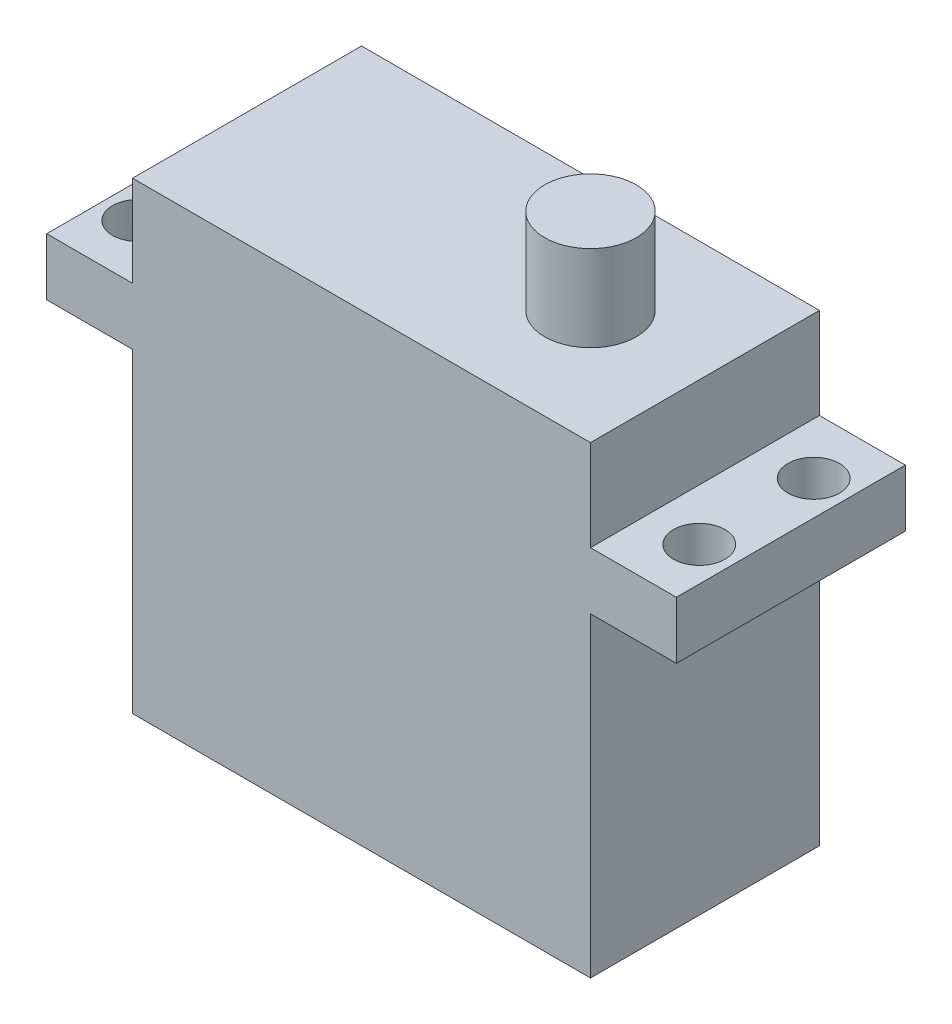
ISO-10303-21;
HEADER;
FILE_DESCRIPTION(('STEP AP214'),'2;1');
FILE_NAME('part.step','',(''),(''),'','','');
FILE_SCHEMA(('AUTOMOTIVE_DESIGN { 1 0 10303 214 1 1 1 1 }'));
ENDSEC;
DATA;
#1=APPLICATION_CONTEXT('core data for automotive mechanical design processes');
#2=APPLICATION_PROTOCOL_DEFINITION('international standard','automotive_design',2000,#1);
#3=PRODUCT_CONTEXT('',#1,'mechanical');
#4=PRODUCT('Part','Part','',(#3));
#5=PRODUCT_RELATED_PRODUCT_CATEGORY('part','',(#4));
#6=PRODUCT_DEFINITION_FORMATION('','',#4);
#7=PRODUCT_DEFINITION_CONTEXT('part definition',#1,'design');
#8=PRODUCT_DEFINITION('design','',#6,#7);
#9=PRODUCT_DEFINITION_SHAPE('','',#8);
#10=(LENGTH_UNIT() NAMED_UNIT(*) SI_UNIT(.MILLI.,.METRE.));
#11=(NAMED_UNIT(*) PLANE_ANGLE_UNIT() SI_UNIT($,.RADIAN.));
#12=(NAMED_UNIT(*) SI_UNIT($,.STERADIAN.) SOLID_ANGLE_UNIT());
#13=UNCERTAINTY_MEASURE_WITH_UNIT(LENGTH_MEASURE(1.E-05),#10,'distance_accuracy_value','');
#14=(GEOMETRIC_REPRESENTATION_CONTEXT(3) GLOBAL_UNCERTAINTY_ASSIGNED_CONTEXT((#13)) GLOBAL_UNIT_ASSIGNED_CONTEXT((#10,
#11,#12)) REPRESENTATION_CONTEXT('',''));
#15=CARTESIAN_POINT('',(0.,0.,0.));
#16=DIRECTION('',(0.,0.,1.));
#17=DIRECTION('',(1.,0.,0.));
#18=AXIS2_PLACEMENT_3D('',#15,#16,#17);
#19=CARTESIAN_POINT('',(-20.,40.5,-10.));
#20=DIRECTION('',(1.,0.,0.));
#21=DIRECTION('',(0.,0.,-1.));
#22=AXIS2_PLACEMENT_3D('',#19,#20,#21);
#23=PLANE('',#22);
#24=DIRECTION('',(0.,-1.,0.));
#25=VECTOR('',#24,1.);
#26=CARTESIAN_POINT('',(-20.,40.5,10.));
#27=LINE('',#26,#25);
#28=CARTESIAN_POINT('',(-20.,27.55,10.));
#29=VERTEX_POINT('',#28);
#30=CARTESIAN_POINT('',(-20.,0.,10.));
#31=VERTEX_POINT('',#30);
#32=EDGE_CURVE('E252',#29,#31,#27,.T.);
#33=ORIENTED_EDGE('',*,*,#32,.F.);
#34=DIRECTION('',(0.,0.,-1.));
#35=VECTOR('',#34,1.);
#36=CARTESIAN_POINT('',(-20.,27.55,10.));
#37=LINE('',#36,#35);
#38=CARTESIAN_POINT('',(-20.,27.55,-10.));
#39=VERTEX_POINT('',#38);
#40=EDGE_CURVE('E158',#29,#39,#37,.T.);
#41=ORIENTED_EDGE('',*,*,#40,.T.);
#42=DIRECTION('',(0.,-1.,0.));
#43=VECTOR('',#42,1.);
#44=CARTESIAN_POINT('',(-20.,40.5,-10.));
#45=LINE('',#44,#43);
#46=CARTESIAN_POINT('',(-20.,0.,-10.));
#47=VERTEX_POINT('',#46);
#48=EDGE_CURVE('E255',#39,#47,#45,.T.);
#49=ORIENTED_EDGE('',*,*,#48,.T.);
#50=DIRECTION('',(0.,0.,1.));
#51=VECTOR('',#50,1.);
#52=CARTESIAN_POINT('',(-20.,0.,-10.));
#53=LINE('',#52,#51);
#54=EDGE_CURVE('E243',#47,#31,#53,.T.);
#55=ORIENTED_EDGE('',*,*,#54,.T.);
#56=EDGE_LOOP('',(#33,#41,#49,#55));
#57=FACE_BOUND('',#56,.T.);
#58=ADVANCED_FACE('F45',(#57),#23,.F.);
#59=CARTESIAN_POINT('',(20.,40.5,-10.));
#60=DIRECTION('',(-1.,0.,0.));
#61=DIRECTION('',(0.,0.,1.));
#62=AXIS2_PLACEMENT_3D('',#59,#60,#61);
#63=PLANE('',#62);
#64=DIRECTION('',(0.,0.,1.));
#65=VECTOR('',#64,1.);
#66=CARTESIAN_POINT('',(20.,32.55,10.));
#67=LINE('',#66,#65);
#68=CARTESIAN_POINT('',(20.,32.55,-10.));
#69=VERTEX_POINT('',#68);
#70=CARTESIAN_POINT('',(20.,32.55,10.));
#71=VERTEX_POINT('',#70);
#72=EDGE_CURVE('E190',#69,#71,#67,.T.);
#73=ORIENTED_EDGE('',*,*,#72,.F.);
#74=DIRECTION('',(0.,-1.,0.));
#75=VECTOR('',#74,1.);
#76=CARTESIAN_POINT('',(20.,40.5,-10.));
#77=LINE('',#76,#75);
#78=CARTESIAN_POINT('',(20.,40.5,-10.));
#79=VERTEX_POINT('',#78);
#80=EDGE_CURVE('E11',#79,#69,#77,.T.);
#81=ORIENTED_EDGE('',*,*,#80,.F.);
#82=DIRECTION('',(0.,0.,-1.));
#83=VECTOR('',#82,1.);
#84=CARTESIAN_POINT('',(20.,40.5,-10.));
#85=LINE('',#84,#83);
#86=CARTESIAN_POINT('',(20.,40.5,10.));
#87=VERTEX_POINT('',#86);
#88=EDGE_CURVE('E221',#87,#79,#85,.T.);
#89=ORIENTED_EDGE('',*,*,#88,.F.);
#90=DIRECTION('',(0.,-1.,0.));
#91=VECTOR('',#90,1.);
#92=CARTESIAN_POINT('',(20.,40.5,10.));
#93=LINE('',#92,#91);
#94=EDGE_CURVE('E249',#87,#71,#93,.T.);
#95=ORIENTED_EDGE('',*,*,#94,.T.);
#96=EDGE_LOOP('',(#73,#81,#89,#95));
#97=FACE_BOUND('',#96,.T.);
#98=ADVANCED_FACE('F47',(#97),#63,.F.);
#99=DIRECTION('',(0.,0.,-1.));
#100=VECTOR('',#99,1.);
#101=CARTESIAN_POINT('',(20.,27.55,10.));
#102=LINE('',#101,#100);
#103=CARTESIAN_POINT('',(20.,27.55,10.));
#104=VERTEX_POINT('',#103);
#105=CARTESIAN_POINT('',(20.,27.55,-10.));
#106=VERTEX_POINT('',#105);
#107=EDGE_CURVE('E71',#104,#106,#102,.T.);
#108=ORIENTED_EDGE('',*,*,#107,.F.);
#109=CARTESIAN_POINT('',(20.,0.,10.));
#110=VERTEX_POINT('',#109);
#111=EDGE_CURVE('E235',#104,#110,#93,.T.);
#112=ORIENTED_EDGE('',*,*,#111,.T.);
#113=DIRECTION('',(0.,0.,-1.));
#114=VECTOR('',#113,1.);
#115=CARTESIAN_POINT('',(20.,0.,-10.));
#116=LINE('',#115,#114);
#117=CARTESIAN_POINT('',(20.,0.,-10.));
#118=VERTEX_POINT('',#117);
#119=EDGE_CURVE('E220',#110,#118,#116,.T.);
#120=ORIENTED_EDGE('',*,*,#119,.T.);
#121=EDGE_CURVE('E55',#106,#118,#77,.T.);
#122=ORIENTED_EDGE('',*,*,#121,.F.);
#123=EDGE_LOOP('',(#108,#112,#120,#122));
#124=FACE_BOUND('',#123,.T.);
#125=ADVANCED_FACE('F336',(#124),#63,.F.);
#126=CARTESIAN_POINT('',(-20.,40.5,-10.));
#127=DIRECTION('',(0.,0.,1.));
#128=DIRECTION('',(1.,0.,0.));
#129=AXIS2_PLACEMENT_3D('',#126,#127,#128);
#130=PLANE('',#129);
#131=DIRECTION('',(-1.,0.,0.));
#132=VECTOR('',#131,1.);
#133=CARTESIAN_POINT('',(-20.,0.,-10.));
#134=LINE('',#133,#132);
#135=EDGE_CURVE('E239',#118,#47,#134,.T.);
#136=ORIENTED_EDGE('',*,*,#135,.T.);
#137=ORIENTED_EDGE('',*,*,#48,.F.);
#138=DIRECTION('',(1.,0.,0.));
#139=VECTOR('',#138,1.);
#140=CARTESIAN_POINT('',(-27.5,27.55,-10.));
#141=LINE('',#140,#139);
#142=CARTESIAN_POINT('',(-27.5,27.55,-10.));
#143=VERTEX_POINT('',#142);
#144=EDGE_CURVE('E180',#143,#39,#141,.T.);
#145=ORIENTED_EDGE('',*,*,#144,.F.);
#146=DIRECTION('',(0.,1.,0.));
#147=VECTOR('',#146,1.);
#148=CARTESIAN_POINT('',(-27.5,32.55,-10.));
#149=LINE('',#148,#147);
#150=CARTESIAN_POINT('',(-27.5,32.55,-10.));
#151=VERTEX_POINT('',#150);
#152=EDGE_CURVE('E162',#143,#151,#149,.T.);
#153=ORIENTED_EDGE('',*,*,#152,.T.);
#154=DIRECTION('',(1.,0.,0.));
#155=VECTOR('',#154,1.);
#156=CARTESIAN_POINT('',(-27.5,32.55,-10.));
#157=LINE('',#156,#155);
#158=CARTESIAN_POINT('',(-20.,32.55,-10.));
#159=VERTEX_POINT('',#158);
#160=EDGE_CURVE('E147',#151,#159,#157,.T.);
#161=ORIENTED_EDGE('',*,*,#160,.T.);
#162=CARTESIAN_POINT('',(-20.,40.5,-10.));
#163=VERTEX_POINT('',#162);
#164=EDGE_CURVE('E256',#163,#159,#45,.T.);
#165=ORIENTED_EDGE('',*,*,#164,.F.);
#166=DIRECTION('',(-1.,0.,0.));
#167=VECTOR('',#166,1.);
#168=CARTESIAN_POINT('',(-20.,40.5,-10.));
#169=LINE('',#168,#167);
#170=EDGE_CURVE('E225',#79,#163,#169,.T.);
#171=ORIENTED_EDGE('',*,*,#170,.F.);
#172=ORIENTED_EDGE('',*,*,#80,.T.);
#173=DIRECTION('',(-1.,0.,0.));
#174=VECTOR('',#173,1.);
#175=CARTESIAN_POINT('',(27.5,32.55,-10.));
#176=LINE('',#175,#174);
#177=CARTESIAN_POINT('',(27.5,32.55,-10.));
#178=VERTEX_POINT('',#177);
#179=EDGE_CURVE('E208',#178,#69,#176,.T.);
#180=ORIENTED_EDGE('',*,*,#179,.F.);
#181=DIRECTION('',(0.,1.,0.));
#182=VECTOR('',#181,1.);
#183=CARTESIAN_POINT('',(27.5,32.55,-10.));
#184=LINE('',#183,#182);
#185=CARTESIAN_POINT('',(27.5,27.55,-10.));
#186=VERTEX_POINT('',#185);
#187=EDGE_CURVE('E193',#186,#178,#184,.T.);
#188=ORIENTED_EDGE('',*,*,#187,.F.);
#189=DIRECTION('',(-1.,0.,0.));
#190=VECTOR('',#189,1.);
#191=CARTESIAN_POINT('',(27.5,27.55,-10.));
#192=LINE('',#191,#190);
#193=EDGE_CURVE('E212',#186,#106,#192,.T.);
#194=ORIENTED_EDGE('',*,*,#193,.T.);
#195=ORIENTED_EDGE('',*,*,#121,.T.);
#196=EDGE_LOOP('',(#136,#137,#145,#153,#161,#165,#171,#172,#180,#188,#194,#195));
#197=FACE_BOUND('',#196,.T.);
#198=ADVANCED_FACE('F316',(#197),#130,.F.);
#199=ORIENTED_EDGE('',*,*,#164,.T.);
#200=DIRECTION('',(0.,0.,1.));
#201=VECTOR('',#200,1.);
#202=CARTESIAN_POINT('',(-20.,32.55,10.));
#203=LINE('',#202,#201);
#204=CARTESIAN_POINT('',(-20.,32.55,10.));
#205=VERTEX_POINT('',#204);
#206=EDGE_CURVE('E171',#159,#205,#203,.T.);
#207=ORIENTED_EDGE('',*,*,#206,.T.);
#208=CARTESIAN_POINT('',(-20.,40.5,10.));
#209=VERTEX_POINT('',#208);
#210=EDGE_CURVE('E145',#209,#205,#27,.T.);
#211=ORIENTED_EDGE('',*,*,#210,.F.);
#212=DIRECTION('',(0.,0.,1.));
#213=VECTOR('',#212,1.);
#214=CARTESIAN_POINT('',(-20.,40.5,-10.));
#215=LINE('',#214,#213);
#216=EDGE_CURVE('E229',#163,#209,#215,.T.);
#217=ORIENTED_EDGE('',*,*,#216,.F.);
#218=EDGE_LOOP('',(#199,#207,#211,#217));
#219=FACE_BOUND('',#218,.T.);
#220=ADVANCED_FACE('F322',(#219),#23,.F.);
#221=CARTESIAN_POINT('',(-20.,40.5,10.));
#222=DIRECTION('',(0.,0.,-1.));
#223=DIRECTION('',(-1.,0.,0.));
#224=AXIS2_PLACEMENT_3D('',#221,#222,#223);
#225=PLANE('',#224);
#226=DIRECTION('',(1.,0.,0.));
#227=VECTOR('',#226,1.);
#228=CARTESIAN_POINT('',(-20.,0.,10.));
#229=LINE('',#228,#227);
#230=EDGE_CURVE('E226',#31,#110,#229,.T.);
#231=ORIENTED_EDGE('',*,*,#230,.T.);
#232=ORIENTED_EDGE('',*,*,#111,.F.);
#233=DIRECTION('',(-1.,0.,0.));
#234=VECTOR('',#233,1.);
#235=CARTESIAN_POINT('',(27.5,27.55,10.));
#236=LINE('',#235,#234);
#237=CARTESIAN_POINT('',(27.5,27.55,10.));
#238=VERTEX_POINT('',#237);
#239=EDGE_CURVE('E216',#238,#104,#236,.T.);
#240=ORIENTED_EDGE('',*,*,#239,.F.);
#241=DIRECTION('',(0.,-1.,0.));
#242=VECTOR('',#241,1.);
#243=CARTESIAN_POINT('',(27.5,32.55,10.));
#244=LINE('',#243,#242);
#245=CARTESIAN_POINT('',(27.5,32.55,10.));
#246=VERTEX_POINT('',#245);
#247=EDGE_CURVE('E185',#246,#238,#244,.T.);
#248=ORIENTED_EDGE('',*,*,#247,.F.);
#249=DIRECTION('',(-1.,0.,0.));
#250=VECTOR('',#249,1.);
#251=CARTESIAN_POINT('',(27.5,32.55,10.));
#252=LINE('',#251,#250);
#253=EDGE_CURVE('E199',#246,#71,#252,.T.);
#254=ORIENTED_EDGE('',*,*,#253,.T.);
#255=ORIENTED_EDGE('',*,*,#94,.F.);
#256=DIRECTION('',(1.,0.,0.));
#257=VECTOR('',#256,1.);
#258=CARTESIAN_POINT('',(-20.,40.5,10.));
#259=LINE('',#258,#257);
#260=EDGE_CURVE('E232',#209,#87,#259,.T.);
#261=ORIENTED_EDGE('',*,*,#260,.F.);
#262=ORIENTED_EDGE('',*,*,#210,.T.);
#263=DIRECTION('',(1.,0.,0.));
#264=VECTOR('',#263,1.);
#265=CARTESIAN_POINT('',(-27.5,32.55,10.));
#266=LINE('',#265,#264);
#267=CARTESIAN_POINT('',(-27.5,32.55,10.));
#268=VERTEX_POINT('',#267);
#269=EDGE_CURVE('E63',#268,#205,#266,.T.);
#270=ORIENTED_EDGE('',*,*,#269,.F.);
#271=DIRECTION('',(0.,-1.,0.));
#272=VECTOR('',#271,1.);
#273=CARTESIAN_POINT('',(-27.5,32.55,10.));
#274=LINE('',#273,#272);
#275=CARTESIAN_POINT('',(-27.5,27.55,10.));
#276=VERTEX_POINT('',#275);
#277=EDGE_CURVE('E141',#268,#276,#274,.T.);
#278=ORIENTED_EDGE('',*,*,#277,.T.);
#279=DIRECTION('',(1.,0.,0.));
#280=VECTOR('',#279,1.);
#281=CARTESIAN_POINT('',(-27.5,27.55,10.));
#282=LINE('',#281,#280);
#283=EDGE_CURVE('E170',#276,#29,#282,.T.);
#284=ORIENTED_EDGE('',*,*,#283,.T.);
#285=ORIENTED_EDGE('',*,*,#32,.T.);
#286=EDGE_LOOP('',(#231,#232,#240,#248,#254,#255,#261,#262,#270,#278,#284,#285));
#287=FACE_BOUND('',#286,.T.);
#288=ADVANCED_FACE('F140',(#287),#225,.F.);
#289=CARTESIAN_POINT('',(0.,40.5,0.));
#290=DIRECTION('',(0.,1.,0.));
#291=DIRECTION('',(0.,0.,1.));
#292=AXIS2_PLACEMENT_3D('',#289,#290,#291);
#293=PLANE('',#292);
#294=CARTESIAN_POINT('',(10.,40.5,0.));
#295=DIRECTION('',(0.,1.,0.));
#296=DIRECTION('',(0.,0.,1.));
#297=AXIS2_PLACEMENT_3D('',#294,#295,#296);
#298=CIRCLE('',#297,4.);
#299=CARTESIAN_POINT('',(10.,40.5,4.));
#300=VERTEX_POINT('',#299);
#301=EDGE_CURVE('E488',#300,#300,#298,.T.);
#302=ORIENTED_EDGE('',*,*,#301,.F.);
#303=EDGE_LOOP('',(#302));
#304=FACE_BOUND('',#303,.T.);
#305=ORIENTED_EDGE('',*,*,#88,.T.);
#306=ORIENTED_EDGE('',*,*,#170,.T.);
#307=ORIENTED_EDGE('',*,*,#216,.T.);
#308=ORIENTED_EDGE('',*,*,#260,.T.);
#309=EDGE_LOOP('',(#305,#306,#307,#308));
#310=FACE_BOUND('',#309,.T.);
#311=ADVANCED_FACE('F319',(#304,#310),#293,.T.);
#312=CARTESIAN_POINT('',(0.,0.,0.));
#313=DIRECTION('',(0.,1.,0.));
#314=DIRECTION('',(0.,0.,1.));
#315=AXIS2_PLACEMENT_3D('',#312,#313,#314);
#316=PLANE('',#315);
#317=ORIENTED_EDGE('',*,*,#119,.F.);
#318=ORIENTED_EDGE('',*,*,#230,.F.);
#319=ORIENTED_EDGE('',*,*,#54,.F.);
#320=ORIENTED_EDGE('',*,*,#135,.F.);
#321=EDGE_LOOP('',(#317,#318,#319,#320));
#322=FACE_BOUND('',#321,.T.);
#323=ADVANCED_FACE('F335',(#322),#316,.F.);
#324=CARTESIAN_POINT('',(27.5,27.55,10.));
#325=DIRECTION('',(0.,1.,0.));
#326=DIRECTION('',(0.,0.,1.));
#327=AXIS2_PLACEMENT_3D('',#324,#325,#326);
#328=PLANE('',#327);
#329=CARTESIAN_POINT('',(24.5,27.55,4.99999999999999));
#330=DIRECTION('',(0.,1.,0.));
#331=DIRECTION('',(0.,0.,1.));
#332=AXIS2_PLACEMENT_3D('',#329,#330,#331);
#333=CIRCLE('',#332,2.25);
#334=CARTESIAN_POINT('',(24.5,27.55,7.24999999999999));
#335=VERTEX_POINT('',#334);
#336=EDGE_CURVE('E174',#335,#335,#333,.F.);
#337=ORIENTED_EDGE('',*,*,#336,.F.);
#338=EDGE_LOOP('',(#337));
#339=FACE_BOUND('',#338,.T.);
#340=CARTESIAN_POINT('',(24.5,27.55,-4.99999999999999));
#341=DIRECTION('',(0.,1.,0.));
#342=DIRECTION('',(0.,0.,1.));
#343=AXIS2_PLACEMENT_3D('',#340,#341,#342);
#344=CIRCLE('',#343,2.25);
#345=CARTESIAN_POINT('',(24.5,27.55,-2.75));
#346=VERTEX_POINT('',#345);
#347=EDGE_CURVE('E273',#346,#346,#344,.F.);
#348=ORIENTED_EDGE('',*,*,#347,.F.);
#349=EDGE_LOOP('',(#348));
#350=FACE_BOUND('',#349,.T.);
#351=ORIENTED_EDGE('',*,*,#107,.T.);
#352=ORIENTED_EDGE('',*,*,#193,.F.);
#353=DIRECTION('',(0.,0.,-1.));
#354=VECTOR('',#353,1.);
#355=CARTESIAN_POINT('',(27.5,27.55,10.));
#356=LINE('',#355,#354);
#357=EDGE_CURVE('E189',#238,#186,#356,.T.);
#358=ORIENTED_EDGE('',*,*,#357,.F.);
#359=ORIENTED_EDGE('',*,*,#239,.T.);
#360=EDGE_LOOP('',(#351,#352,#358,#359));
#361=FACE_BOUND('',#360,.T.);
#362=ADVANCED_FACE('F300',(#339,#350,#361),#328,.F.);
#363=CARTESIAN_POINT('',(27.5,32.55,10.));
#364=DIRECTION('',(0.,-1.,0.));
#365=DIRECTION('',(0.,0.,-1.));
#366=AXIS2_PLACEMENT_3D('',#363,#364,#365);
#367=PLANE('',#366);
#368=CARTESIAN_POINT('',(24.5,32.55,4.99999999999999));
#369=DIRECTION('',(0.,-1.,0.));
#370=DIRECTION('',(0.,0.,-1.));
#371=AXIS2_PLACEMENT_3D('',#368,#369,#370);
#372=CIRCLE('',#371,2.25);
#373=CARTESIAN_POINT('',(24.5,32.55,2.75));
#374=VERTEX_POINT('',#373);
#375=EDGE_CURVE('E49',#374,#374,#372,.F.);
#376=ORIENTED_EDGE('',*,*,#375,.F.);
#377=EDGE_LOOP('',(#376));
#378=FACE_BOUND('',#377,.T.);
#379=CARTESIAN_POINT('',(24.5,32.55,-4.99999999999999));
#380=DIRECTION('',(0.,-1.,0.));
#381=DIRECTION('',(0.,0.,-1.));
#382=AXIS2_PLACEMENT_3D('',#379,#380,#381);
#383=CIRCLE('',#382,2.25);
#384=CARTESIAN_POINT('',(24.5,32.55,-7.24999999999999));
#385=VERTEX_POINT('',#384);
#386=EDGE_CURVE('E270',#385,#385,#383,.F.);
#387=ORIENTED_EDGE('',*,*,#386,.F.);
#388=EDGE_LOOP('',(#387));
#389=FACE_BOUND('',#388,.T.);
#390=ORIENTED_EDGE('',*,*,#72,.T.);
#391=ORIENTED_EDGE('',*,*,#253,.F.);
#392=DIRECTION('',(0.,0.,1.));
#393=VECTOR('',#392,1.);
#394=CARTESIAN_POINT('',(27.5,32.55,10.));
#395=LINE('',#394,#393);
#396=EDGE_CURVE('E196',#178,#246,#395,.T.);
#397=ORIENTED_EDGE('',*,*,#396,.F.);
#398=ORIENTED_EDGE('',*,*,#179,.T.);
#399=EDGE_LOOP('',(#390,#391,#397,#398));
#400=FACE_BOUND('',#399,.T.);
#401=ADVANCED_FACE('F296',(#378,#389,#400),#367,.F.);
#402=CARTESIAN_POINT('',(27.5,0.,0.));
#403=DIRECTION('',(1.,0.,0.));
#404=DIRECTION('',(0.,0.,-1.));
#405=AXIS2_PLACEMENT_3D('',#402,#403,#404);
#406=PLANE('',#405);
#407=ORIENTED_EDGE('',*,*,#247,.T.);
#408=ORIENTED_EDGE('',*,*,#357,.T.);
#409=ORIENTED_EDGE('',*,*,#187,.T.);
#410=ORIENTED_EDGE('',*,*,#396,.T.);
#411=EDGE_LOOP('',(#407,#408,#409,#410));
#412=FACE_BOUND('',#411,.T.);
#413=ADVANCED_FACE('F299',(#412),#406,.T.);
#414=CARTESIAN_POINT('',(-27.5,32.55,10.));
#415=DIRECTION('',(0.,1.,0.));
#416=DIRECTION('',(0.,0.,1.));
#417=AXIS2_PLACEMENT_3D('',#414,#415,#416);
#418=PLANE('',#417);
#419=CARTESIAN_POINT('',(-24.5,32.55,5.00000000000001));
#420=DIRECTION('',(0.,1.,0.));
#421=DIRECTION('',(0.,0.,1.));
#422=AXIS2_PLACEMENT_3D('',#419,#420,#421);
#423=CIRCLE('',#422,2.25);
#424=CARTESIAN_POINT('',(-24.5,32.55,7.25));
#425=VERTEX_POINT('',#424);
#426=EDGE_CURVE('E269',#425,#425,#423,.F.);
#427=ORIENTED_EDGE('',*,*,#426,.T.);
#428=EDGE_LOOP('',(#427));
#429=FACE_BOUND('',#428,.T.);
#430=CARTESIAN_POINT('',(-24.5,32.55,-4.99999999999999));
#431=DIRECTION('',(0.,1.,0.));
#432=DIRECTION('',(0.,0.,1.));
#433=AXIS2_PLACEMENT_3D('',#430,#431,#432);
#434=CIRCLE('',#433,2.25);
#435=CARTESIAN_POINT('',(-24.5,32.55,-2.75));
#436=VERTEX_POINT('',#435);
#437=EDGE_CURVE('E264',#436,#436,#434,.F.);
#438=ORIENTED_EDGE('',*,*,#437,.T.);
#439=EDGE_LOOP('',(#438));
#440=FACE_BOUND('',#439,.T.);
#441=ORIENTED_EDGE('',*,*,#206,.F.);
#442=ORIENTED_EDGE('',*,*,#160,.F.);
#443=DIRECTION('',(0.,0.,1.));
#444=VECTOR('',#443,1.);
#445=CARTESIAN_POINT('',(-27.5,32.55,10.));
#446=LINE('',#445,#444);
#447=EDGE_CURVE('E153',#151,#268,#446,.T.);
#448=ORIENTED_EDGE('',*,*,#447,.T.);
#449=ORIENTED_EDGE('',*,*,#269,.T.);
#450=EDGE_LOOP('',(#441,#442,#448,#449));
#451=FACE_BOUND('',#450,.T.);
#452=ADVANCED_FACE('F160',(#429,#440,#451),#418,.T.);
#453=CARTESIAN_POINT('',(-27.5,27.55,10.));
#454=DIRECTION('',(0.,-1.,0.));
#455=DIRECTION('',(0.,0.,-1.));
#456=AXIS2_PLACEMENT_3D('',#453,#454,#455);
#457=PLANE('',#456);
#458=CARTESIAN_POINT('',(-24.5,27.55,5.00000000000001));
#459=DIRECTION('',(0.,-1.,0.));
#460=DIRECTION('',(0.,0.,-1.));
#461=AXIS2_PLACEMENT_3D('',#458,#459,#460);
#462=CIRCLE('',#461,2.25);
#463=CARTESIAN_POINT('',(-24.5,27.55,2.75000000000001));
#464=VERTEX_POINT('',#463);
#465=EDGE_CURVE('E266',#464,#464,#462,.F.);
#466=ORIENTED_EDGE('',*,*,#465,.T.);
#467=EDGE_LOOP('',(#466));
#468=FACE_BOUND('',#467,.T.);
#469=CARTESIAN_POINT('',(-24.5,27.55,-4.99999999999999));
#470=DIRECTION('',(0.,-1.,0.));
#471=DIRECTION('',(0.,0.,-1.));
#472=AXIS2_PLACEMENT_3D('',#469,#470,#471);
#473=CIRCLE('',#472,2.25);
#474=CARTESIAN_POINT('',(-24.5,27.55,-7.24999999999999));
#475=VERTEX_POINT('',#474);
#476=EDGE_CURVE('E260',#475,#475,#473,.F.);
#477=ORIENTED_EDGE('',*,*,#476,.T.);
#478=EDGE_LOOP('',(#477));
#479=FACE_BOUND('',#478,.T.);
#480=ORIENTED_EDGE('',*,*,#40,.F.);
#481=ORIENTED_EDGE('',*,*,#283,.F.);
#482=DIRECTION('',(0.,0.,-1.));
#483=VECTOR('',#482,1.);
#484=CARTESIAN_POINT('',(-27.5,27.55,10.));
#485=LINE('',#484,#483);
#486=EDGE_CURVE('E156',#276,#143,#485,.T.);
#487=ORIENTED_EDGE('',*,*,#486,.T.);
#488=ORIENTED_EDGE('',*,*,#144,.T.);
#489=EDGE_LOOP('',(#480,#481,#487,#488));
#490=FACE_BOUND('',#489,.T.);
#491=ADVANCED_FACE('F326',(#468,#479,#490),#457,.T.);
#492=CARTESIAN_POINT('',(-27.5,0.,0.));
#493=DIRECTION('',(-1.,0.,0.));
#494=DIRECTION('',(0.,0.,-1.));
#495=AXIS2_PLACEMENT_3D('',#492,#493,#494);
#496=PLANE('',#495);
#497=ORIENTED_EDGE('',*,*,#277,.F.);
#498=ORIENTED_EDGE('',*,*,#447,.F.);
#499=ORIENTED_EDGE('',*,*,#152,.F.);
#500=ORIENTED_EDGE('',*,*,#486,.F.);
#501=EDGE_LOOP('',(#497,#498,#499,#500));
#502=FACE_BOUND('',#501,.T.);
#503=ADVANCED_FACE('F151',(#502),#496,.T.);
#504=CARTESIAN_POINT('',(-24.5,40.5,-4.99999999999999));
#505=DIRECTION('',(0.,-1.,0.));
#506=DIRECTION('',(0.,0.,-1.));
#507=AXIS2_PLACEMENT_3D('',#504,#505,#506);
#508=CYLINDRICAL_SURFACE('',#507,2.25);
#509=ORIENTED_EDGE('',*,*,#437,.F.);
#510=EDGE_LOOP('',(#509));
#511=FACE_BOUND('',#510,.T.);
#512=ORIENTED_EDGE('',*,*,#476,.F.);
#513=EDGE_LOOP('',(#512));
#514=FACE_BOUND('',#513,.T.);
#515=ADVANCED_FACE('F426',(#511,#514),#508,.F.);
#516=CARTESIAN_POINT('',(-24.5,40.5,5.00000000000001));
#517=DIRECTION('',(0.,-1.,0.));
#518=DIRECTION('',(0.,0.,-1.));
#519=AXIS2_PLACEMENT_3D('',#516,#517,#518);
#520=CYLINDRICAL_SURFACE('',#519,2.25);
#521=ORIENTED_EDGE('',*,*,#426,.F.);
#522=EDGE_LOOP('',(#521));
#523=FACE_BOUND('',#522,.T.);
#524=ORIENTED_EDGE('',*,*,#465,.F.);
#525=EDGE_LOOP('',(#524));
#526=FACE_BOUND('',#525,.T.);
#527=ADVANCED_FACE('F434',(#523,#526),#520,.F.);
#528=CARTESIAN_POINT('',(24.5,40.5,-4.99999999999999));
#529=DIRECTION('',(0.,-1.,0.));
#530=DIRECTION('',(0.,0.,-1.));
#531=AXIS2_PLACEMENT_3D('',#528,#529,#530);
#532=CYLINDRICAL_SURFACE('',#531,2.25);
#533=ORIENTED_EDGE('',*,*,#386,.T.);
#534=EDGE_LOOP('',(#533));
#535=FACE_BOUND('',#534,.T.);
#536=ORIENTED_EDGE('',*,*,#347,.T.);
#537=EDGE_LOOP('',(#536));
#538=FACE_BOUND('',#537,.T.);
#539=ADVANCED_FACE('F444',(#535,#538),#532,.F.);
#540=CARTESIAN_POINT('',(24.5,40.5,4.99999999999999));
#541=DIRECTION('',(0.,-1.,0.));
#542=DIRECTION('',(0.,0.,-1.));
#543=AXIS2_PLACEMENT_3D('',#540,#541,#542);
#544=CYLINDRICAL_SURFACE('',#543,2.25);
#545=ORIENTED_EDGE('',*,*,#375,.T.);
#546=EDGE_LOOP('',(#545));
#547=FACE_BOUND('',#546,.T.);
#548=ORIENTED_EDGE('',*,*,#336,.T.);
#549=EDGE_LOOP('',(#548));
#550=FACE_BOUND('',#549,.T.);
#551=ADVANCED_FACE('F294',(#547,#550),#544,.F.);
#552=CARTESIAN_POINT('',(10.,48.,0.));
#553=DIRECTION('',(0.,-1.,0.));
#554=DIRECTION('',(0.,0.,-1.));
#555=AXIS2_PLACEMENT_3D('',#552,#553,#554);
#556=CYLINDRICAL_SURFACE('',#555,4.);
#557=CARTESIAN_POINT('',(10.,48.,0.));
#558=DIRECTION('',(0.,1.,0.));
#559=DIRECTION('',(0.,0.,1.));
#560=AXIS2_PLACEMENT_3D('',#557,#558,#559);
#561=CIRCLE('',#560,4.);
#562=CARTESIAN_POINT('',(10.,48.,4.));
#563=VERTEX_POINT('',#562);
#564=EDGE_CURVE('E265',#563,#563,#561,.T.);
#565=ORIENTED_EDGE('',*,*,#564,.F.);
#566=EDGE_LOOP('',(#565));
#567=FACE_BOUND('',#566,.T.);
#568=ORIENTED_EDGE('',*,*,#301,.T.);
#569=EDGE_LOOP('',(#568));
#570=FACE_BOUND('',#569,.T.);
#571=ADVANCED_FACE('F462',(#567,#570),#556,.T.);
#572=CARTESIAN_POINT('',(10.,48.,0.));
#573=DIRECTION('',(0.,1.,0.));
#574=DIRECTION('',(0.,0.,1.));
#575=AXIS2_PLACEMENT_3D('',#572,#573,#574);
#576=PLANE('',#575);
#577=ORIENTED_EDGE('',*,*,#564,.T.);
#578=EDGE_LOOP('',(#577));
#579=FACE_BOUND('',#578,.T.);
#580=ADVANCED_FACE('F472',(#579),#576,.T.);
#581=CLOSED_SHELL('',(#58,#98,#125,#198,#220,#288,#311,#323,#362,#401,#413,#452,#491,#503,#515,
#527,#539,#551,#571,#580));
#582=MANIFOLD_SOLID_BREP('B2',#581);
#583=ADVANCED_BREP_SHAPE_REPRESENTATION('',(#18,#582),#14);
#584=SHAPE_DEFINITION_REPRESENTATION(#9,#583);
ENDSEC;
END-ISO-10303-21;
